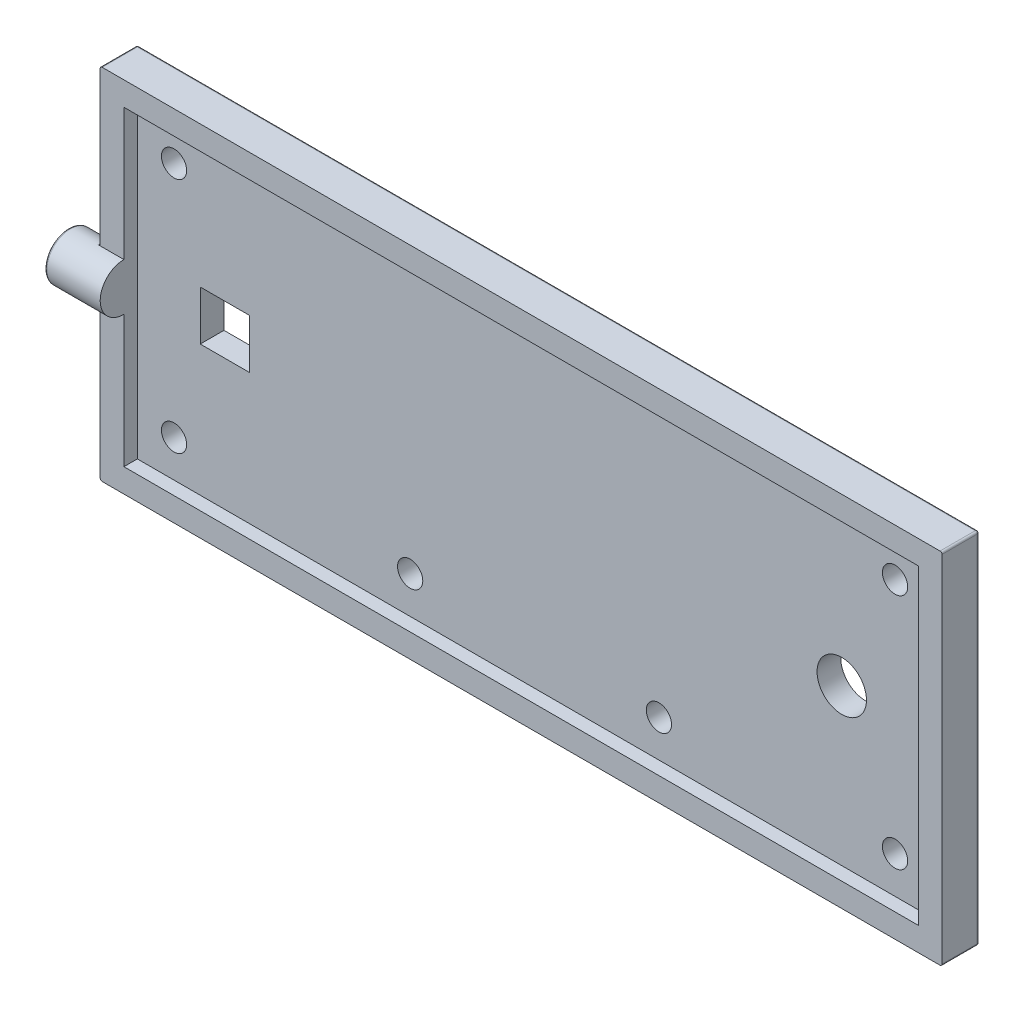
ISO-10303-21;
HEADER;
FILE_DESCRIPTION(('STEP AP214'),'2;1');
FILE_NAME('part.step','',(''),(''),'','','');
FILE_SCHEMA(('AUTOMOTIVE_DESIGN { 1 0 10303 214 1 1 1 1 }'));
ENDSEC;
DATA;
#1=APPLICATION_CONTEXT('core data for automotive mechanical design processes');
#2=APPLICATION_PROTOCOL_DEFINITION('international standard','automotive_design',2000,#1);
#3=PRODUCT_CONTEXT('',#1,'mechanical');
#4=PRODUCT('Part','Part','',(#3));
#5=PRODUCT_RELATED_PRODUCT_CATEGORY('part','',(#4));
#6=PRODUCT_DEFINITION_FORMATION('','',#4);
#7=PRODUCT_DEFINITION_CONTEXT('part definition',#1,'design');
#8=PRODUCT_DEFINITION('design','',#6,#7);
#9=PRODUCT_DEFINITION_SHAPE('','',#8);
#10=(LENGTH_UNIT() NAMED_UNIT(*) SI_UNIT(.MILLI.,.METRE.));
#11=(NAMED_UNIT(*) PLANE_ANGLE_UNIT() SI_UNIT($,.RADIAN.));
#12=(NAMED_UNIT(*) SI_UNIT($,.STERADIAN.) SOLID_ANGLE_UNIT());
#13=UNCERTAINTY_MEASURE_WITH_UNIT(LENGTH_MEASURE(1.E-05),#10,'distance_accuracy_value','');
#14=(GEOMETRIC_REPRESENTATION_CONTEXT(3) GLOBAL_UNCERTAINTY_ASSIGNED_CONTEXT((#13)) GLOBAL_UNIT_ASSIGNED_CONTEXT((#10,
#11,#12)) REPRESENTATION_CONTEXT('',''));
#15=CARTESIAN_POINT('',(0.,0.,0.));
#16=DIRECTION('',(0.,0.,1.));
#17=DIRECTION('',(1.,0.,0.));
#18=AXIS2_PLACEMENT_3D('',#15,#16,#17);
#19=CARTESIAN_POINT('',(0.,25.81,3.));
#20=DIRECTION('',(0.,1.,0.));
#21=DIRECTION('',(0.,0.,1.));
#22=AXIS2_PLACEMENT_3D('',#19,#20,#21);
#23=PLANE('',#22);
#24=DIRECTION('',(1.,0.,0.));
#25=VECTOR('',#24,1.);
#26=CARTESIAN_POINT('',(0.,25.81,0.));
#27=LINE('',#26,#25);
#28=CARTESIAN_POINT('',(10.955,25.81,0.));
#29=VERTEX_POINT('',#28);
#30=CARTESIAN_POINT('',(17.205,25.81,0.));
#31=VERTEX_POINT('',#30);
#32=EDGE_CURVE('E348',#29,#31,#27,.T.);
#33=ORIENTED_EDGE('',*,*,#32,.T.);
#34=DIRECTION('',(0.,0.,-1.));
#35=VECTOR('',#34,1.);
#36=CARTESIAN_POINT('',(17.205,25.81,3.));
#37=LINE('',#36,#35);
#38=CARTESIAN_POINT('',(17.205,25.81,3.));
#39=VERTEX_POINT('',#38);
#40=EDGE_CURVE('E371',#39,#31,#37,.T.);
#41=ORIENTED_EDGE('',*,*,#40,.F.);
#42=DIRECTION('',(1.,0.,0.));
#43=VECTOR('',#42,1.);
#44=CARTESIAN_POINT('',(0.,25.81,3.));
#45=LINE('',#44,#43);
#46=CARTESIAN_POINT('',(10.955,25.81,3.));
#47=VERTEX_POINT('',#46);
#48=EDGE_CURVE('E305',#47,#39,#45,.T.);
#49=ORIENTED_EDGE('',*,*,#48,.F.);
#50=DIRECTION('',(0.,0.,-1.));
#51=VECTOR('',#50,1.);
#52=CARTESIAN_POINT('',(10.955,25.81,3.));
#53=LINE('',#52,#51);
#54=EDGE_CURVE('E320',#47,#29,#53,.T.);
#55=ORIENTED_EDGE('',*,*,#54,.T.);
#56=EDGE_LOOP('',(#33,#41,#49,#55));
#57=FACE_BOUND('',#56,.T.);
#58=ADVANCED_FACE('F41',(#57),#23,.F.);
#59=CARTESIAN_POINT('',(17.205,0.,3.));
#60=DIRECTION('',(1.,0.,0.));
#61=DIRECTION('',(0.,0.,-1.));
#62=AXIS2_PLACEMENT_3D('',#59,#60,#61);
#63=PLANE('',#62);
#64=DIRECTION('',(0.,-1.,0.));
#65=VECTOR('',#64,1.);
#66=CARTESIAN_POINT('',(17.205,0.,0.));
#67=LINE('',#66,#65);
#68=CARTESIAN_POINT('',(17.205,19.56,0.));
#69=VERTEX_POINT('',#68);
#70=EDGE_CURVE('E352',#31,#69,#67,.T.);
#71=ORIENTED_EDGE('',*,*,#70,.T.);
#72=DIRECTION('',(0.,0.,-1.));
#73=VECTOR('',#72,1.);
#74=CARTESIAN_POINT('',(17.205,19.56,3.));
#75=LINE('',#74,#73);
#76=CARTESIAN_POINT('',(17.205,19.56,3.));
#77=VERTEX_POINT('',#76);
#78=EDGE_CURVE('E368',#77,#69,#75,.T.);
#79=ORIENTED_EDGE('',*,*,#78,.F.);
#80=DIRECTION('',(0.,-1.,0.));
#81=VECTOR('',#80,1.);
#82=CARTESIAN_POINT('',(17.205,0.,3.));
#83=LINE('',#82,#81);
#84=EDGE_CURVE('E309',#39,#77,#83,.T.);
#85=ORIENTED_EDGE('',*,*,#84,.F.);
#86=ORIENTED_EDGE('',*,*,#40,.T.);
#87=EDGE_LOOP('',(#71,#79,#85,#86));
#88=FACE_BOUND('',#87,.T.);
#89=ADVANCED_FACE('F586',(#88),#63,.F.);
#90=CARTESIAN_POINT('',(0.,19.56,3.));
#91=DIRECTION('',(0.,1.,0.));
#92=DIRECTION('',(0.,0.,1.));
#93=AXIS2_PLACEMENT_3D('',#90,#91,#92);
#94=PLANE('',#93);
#95=DIRECTION('',(1.,0.,0.));
#96=VECTOR('',#95,1.);
#97=CARTESIAN_POINT('',(0.,19.56,0.));
#98=LINE('',#97,#96);
#99=CARTESIAN_POINT('',(10.955,19.56,0.));
#100=VERTEX_POINT('',#99);
#101=EDGE_CURVE('E356',#100,#69,#98,.T.);
#102=ORIENTED_EDGE('',*,*,#101,.F.);
#103=DIRECTION('',(0.,0.,-1.));
#104=VECTOR('',#103,1.);
#105=CARTESIAN_POINT('',(10.955,19.56,3.));
#106=LINE('',#105,#104);
#107=CARTESIAN_POINT('',(10.955,19.56,3.));
#108=VERTEX_POINT('',#107);
#109=EDGE_CURVE('E365',#108,#100,#106,.T.);
#110=ORIENTED_EDGE('',*,*,#109,.F.);
#111=DIRECTION('',(1.,0.,0.));
#112=VECTOR('',#111,1.);
#113=CARTESIAN_POINT('',(0.,19.56,3.));
#114=LINE('',#113,#112);
#115=EDGE_CURVE('E312',#108,#77,#114,.T.);
#116=ORIENTED_EDGE('',*,*,#115,.T.);
#117=ORIENTED_EDGE('',*,*,#78,.T.);
#118=EDGE_LOOP('',(#102,#110,#116,#117));
#119=FACE_BOUND('',#118,.T.);
#120=ADVANCED_FACE('F592',(#119),#94,.T.);
#121=CARTESIAN_POINT('',(7.63999999999999,7.68,3.));
#122=DIRECTION('',(0.,0.,-1.));
#123=DIRECTION('',(-1.,0.,0.));
#124=AXIS2_PLACEMENT_3D('',#121,#122,#123);
#125=CYLINDRICAL_SURFACE('',#124,1.595);
#126=CARTESIAN_POINT('',(7.63999999999999,7.68,3.));
#127=DIRECTION('',(0.,0.,1.));
#128=DIRECTION('',(1.,0.,0.));
#129=AXIS2_PLACEMENT_3D('',#126,#127,#128);
#130=CIRCLE('',#129,1.595);
#131=CARTESIAN_POINT('',(9.23499999999999,7.68,3.));
#132=VERTEX_POINT('',#131);
#133=EDGE_CURVE('E288',#132,#132,#130,.T.);
#134=ORIENTED_EDGE('',*,*,#133,.T.);
#135=EDGE_LOOP('',(#134));
#136=FACE_BOUND('',#135,.T.);
#137=CARTESIAN_POINT('',(7.63999999999999,7.68,0.));
#138=DIRECTION('',(0.,0.,1.));
#139=DIRECTION('',(1.,0.,0.));
#140=AXIS2_PLACEMENT_3D('',#137,#138,#139);
#141=CIRCLE('',#140,1.595);
#142=CARTESIAN_POINT('',(9.23499999999999,7.68,0.));
#143=VERTEX_POINT('',#142);
#144=EDGE_CURVE('E344',#143,#143,#141,.T.);
#145=ORIENTED_EDGE('',*,*,#144,.F.);
#146=EDGE_LOOP('',(#145));
#147=FACE_BOUND('',#146,.T.);
#148=ADVANCED_FACE('F597',(#136,#147),#125,.F.);
#149=CARTESIAN_POINT('',(37.5,7.68,3.));
#150=DIRECTION('',(0.,0.,-1.));
#151=DIRECTION('',(-1.,0.,0.));
#152=AXIS2_PLACEMENT_3D('',#149,#150,#151);
#153=CYLINDRICAL_SURFACE('',#152,1.595);
#154=CARTESIAN_POINT('',(37.5,7.68,3.));
#155=DIRECTION('',(0.,0.,1.));
#156=DIRECTION('',(1.,0.,0.));
#157=AXIS2_PLACEMENT_3D('',#154,#155,#156);
#158=CIRCLE('',#157,1.595);
#159=CARTESIAN_POINT('',(39.095,7.68,3.));
#160=VERTEX_POINT('',#159);
#161=EDGE_CURVE('E284',#160,#160,#158,.T.);
#162=ORIENTED_EDGE('',*,*,#161,.T.);
#163=EDGE_LOOP('',(#162));
#164=FACE_BOUND('',#163,.T.);
#165=CARTESIAN_POINT('',(37.5,7.68,0.));
#166=DIRECTION('',(0.,0.,1.));
#167=DIRECTION('',(1.,0.,0.));
#168=AXIS2_PLACEMENT_3D('',#165,#166,#167);
#169=CIRCLE('',#168,1.595);
#170=CARTESIAN_POINT('',(39.095,7.68,0.));
#171=VERTEX_POINT('',#170);
#172=EDGE_CURVE('E340',#171,#171,#169,.T.);
#173=ORIENTED_EDGE('',*,*,#172,.F.);
#174=EDGE_LOOP('',(#173));
#175=FACE_BOUND('',#174,.T.);
#176=ADVANCED_FACE('F600',(#164,#175),#153,.F.);
#177=CARTESIAN_POINT('',(68.96,7.68,3.));
#178=DIRECTION('',(0.,0.,-1.));
#179=DIRECTION('',(-1.,0.,0.));
#180=AXIS2_PLACEMENT_3D('',#177,#178,#179);
#181=CYLINDRICAL_SURFACE('',#180,1.595);
#182=CARTESIAN_POINT('',(68.96,7.68,3.));
#183=DIRECTION('',(0.,0.,1.));
#184=DIRECTION('',(1.,0.,0.));
#185=AXIS2_PLACEMENT_3D('',#182,#183,#184);
#186=CIRCLE('',#185,1.595);
#187=CARTESIAN_POINT('',(70.555,7.68,3.));
#188=VERTEX_POINT('',#187);
#189=EDGE_CURVE('E280',#188,#188,#186,.T.);
#190=ORIENTED_EDGE('',*,*,#189,.T.);
#191=EDGE_LOOP('',(#190));
#192=FACE_BOUND('',#191,.T.);
#193=CARTESIAN_POINT('',(68.96,7.68,0.));
#194=DIRECTION('',(0.,0.,1.));
#195=DIRECTION('',(1.,0.,0.));
#196=AXIS2_PLACEMENT_3D('',#193,#194,#195);
#197=CIRCLE('',#196,1.595);
#198=CARTESIAN_POINT('',(70.555,7.68,0.));
#199=VERTEX_POINT('',#198);
#200=EDGE_CURVE('E336',#199,#199,#197,.T.);
#201=ORIENTED_EDGE('',*,*,#200,.F.);
#202=EDGE_LOOP('',(#201));
#203=FACE_BOUND('',#202,.T.);
#204=ADVANCED_FACE('F604',(#192,#203),#181,.F.);
#205=CARTESIAN_POINT('',(98.82,7.68,3.));
#206=DIRECTION('',(0.,0.,-1.));
#207=DIRECTION('',(-1.,0.,0.));
#208=AXIS2_PLACEMENT_3D('',#205,#206,#207);
#209=CYLINDRICAL_SURFACE('',#208,1.595);
#210=CARTESIAN_POINT('',(98.82,7.68,3.));
#211=DIRECTION('',(0.,0.,1.));
#212=DIRECTION('',(1.,0.,0.));
#213=AXIS2_PLACEMENT_3D('',#210,#211,#212);
#214=CIRCLE('',#213,1.595);
#215=CARTESIAN_POINT('',(100.415,7.68,3.));
#216=VERTEX_POINT('',#215);
#217=EDGE_CURVE('E276',#216,#216,#214,.T.);
#218=ORIENTED_EDGE('',*,*,#217,.T.);
#219=EDGE_LOOP('',(#218));
#220=FACE_BOUND('',#219,.T.);
#221=CARTESIAN_POINT('',(98.82,7.68,0.));
#222=DIRECTION('',(0.,0.,1.));
#223=DIRECTION('',(1.,0.,0.));
#224=AXIS2_PLACEMENT_3D('',#221,#222,#223);
#225=CIRCLE('',#224,1.595);
#226=CARTESIAN_POINT('',(100.415,7.68,0.));
#227=VERTEX_POINT('',#226);
#228=EDGE_CURVE('E332',#227,#227,#225,.T.);
#229=ORIENTED_EDGE('',*,*,#228,.F.);
#230=EDGE_LOOP('',(#229));
#231=FACE_BOUND('',#230,.T.);
#232=ADVANCED_FACE('F608',(#220,#231),#209,.F.);
#233=CARTESIAN_POINT('',(7.63999999999999,37.69,3.));
#234=DIRECTION('',(0.,0.,-1.));
#235=DIRECTION('',(-1.,0.,0.));
#236=AXIS2_PLACEMENT_3D('',#233,#234,#235);
#237=CYLINDRICAL_SURFACE('',#236,1.595);
#238=CARTESIAN_POINT('',(7.63999999999999,37.69,3.));
#239=DIRECTION('',(0.,0.,1.));
#240=DIRECTION('',(1.,0.,0.));
#241=AXIS2_PLACEMENT_3D('',#238,#239,#240);
#242=CIRCLE('',#241,1.595);
#243=CARTESIAN_POINT('',(9.23499999999999,37.69,3.));
#244=VERTEX_POINT('',#243);
#245=EDGE_CURVE('E272',#244,#244,#242,.T.);
#246=ORIENTED_EDGE('',*,*,#245,.T.);
#247=EDGE_LOOP('',(#246));
#248=FACE_BOUND('',#247,.T.);
#249=CARTESIAN_POINT('',(7.63999999999999,37.69,0.));
#250=DIRECTION('',(0.,0.,1.));
#251=DIRECTION('',(1.,0.,0.));
#252=AXIS2_PLACEMENT_3D('',#249,#250,#251);
#253=CIRCLE('',#252,1.595);
#254=CARTESIAN_POINT('',(9.23499999999999,37.69,0.));
#255=VERTEX_POINT('',#254);
#256=EDGE_CURVE('E328',#255,#255,#253,.T.);
#257=ORIENTED_EDGE('',*,*,#256,.F.);
#258=EDGE_LOOP('',(#257));
#259=FACE_BOUND('',#258,.T.);
#260=ADVANCED_FACE('F612',(#248,#259),#237,.F.);
#261=CARTESIAN_POINT('',(98.82,37.69,3.));
#262=DIRECTION('',(0.,0.,-1.));
#263=DIRECTION('',(-1.,0.,0.));
#264=AXIS2_PLACEMENT_3D('',#261,#262,#263);
#265=CYLINDRICAL_SURFACE('',#264,1.595);
#266=CARTESIAN_POINT('',(98.82,37.69,3.));
#267=DIRECTION('',(0.,0.,1.));
#268=DIRECTION('',(1.,0.,0.));
#269=AXIS2_PLACEMENT_3D('',#266,#267,#268);
#270=CIRCLE('',#269,1.595);
#271=CARTESIAN_POINT('',(100.415,37.69,3.));
#272=VERTEX_POINT('',#271);
#273=EDGE_CURVE('E267',#272,#272,#270,.T.);
#274=ORIENTED_EDGE('',*,*,#273,.T.);
#275=EDGE_LOOP('',(#274));
#276=FACE_BOUND('',#275,.T.);
#277=CARTESIAN_POINT('',(98.82,37.69,0.));
#278=DIRECTION('',(0.,0.,1.));
#279=DIRECTION('',(1.,0.,0.));
#280=AXIS2_PLACEMENT_3D('',#277,#278,#279);
#281=CIRCLE('',#280,1.595);
#282=CARTESIAN_POINT('',(100.415,37.69,0.));
#283=VERTEX_POINT('',#282);
#284=EDGE_CURVE('E324',#283,#283,#281,.T.);
#285=ORIENTED_EDGE('',*,*,#284,.F.);
#286=EDGE_LOOP('',(#285));
#287=FACE_BOUND('',#286,.T.);
#288=ADVANCED_FACE('F616',(#276,#287),#265,.F.);
#289=CARTESIAN_POINT('',(92.08,22.685,3.));
#290=DIRECTION('',(0.,0.,-1.));
#291=DIRECTION('',(-1.,0.,0.));
#292=AXIS2_PLACEMENT_3D('',#289,#290,#291);
#293=CYLINDRICAL_SURFACE('',#292,3.125);
#294=CARTESIAN_POINT('',(92.08,22.685,3.));
#295=DIRECTION('',(0.,0.,1.));
#296=DIRECTION('',(1.,0.,0.));
#297=AXIS2_PLACEMENT_3D('',#294,#295,#296);
#298=CIRCLE('',#297,3.125);
#299=CARTESIAN_POINT('',(95.205,22.685,3.));
#300=VERTEX_POINT('',#299);
#301=EDGE_CURVE('E263',#300,#300,#298,.T.);
#302=ORIENTED_EDGE('',*,*,#301,.T.);
#303=EDGE_LOOP('',(#302));
#304=FACE_BOUND('',#303,.T.);
#305=CARTESIAN_POINT('',(92.08,22.685,0.));
#306=DIRECTION('',(0.,0.,1.));
#307=DIRECTION('',(1.,0.,0.));
#308=AXIS2_PLACEMENT_3D('',#305,#306,#307);
#309=CIRCLE('',#308,3.125);
#310=CARTESIAN_POINT('',(95.205,22.685,0.));
#311=VERTEX_POINT('',#310);
#312=EDGE_CURVE('E262',#311,#311,#309,.T.);
#313=ORIENTED_EDGE('',*,*,#312,.F.);
#314=EDGE_LOOP('',(#313));
#315=FACE_BOUND('',#314,.T.);
#316=ADVANCED_FACE('F620',(#304,#315),#293,.F.);
#317=CARTESIAN_POINT('',(10.955,0.,3.));
#318=DIRECTION('',(1.,0.,0.));
#319=DIRECTION('',(0.,1.,0.));
#320=AXIS2_PLACEMENT_3D('',#317,#318,#319);
#321=PLANE('',#320);
#322=DIRECTION('',(0.,-1.,0.));
#323=VECTOR('',#322,1.);
#324=CARTESIAN_POINT('',(10.955,0.,0.));
#325=LINE('',#324,#323);
#326=EDGE_CURVE('E268',#29,#100,#325,.T.);
#327=ORIENTED_EDGE('',*,*,#326,.F.);
#328=ORIENTED_EDGE('',*,*,#54,.F.);
#329=DIRECTION('',(0.,-1.,0.));
#330=VECTOR('',#329,1.);
#331=CARTESIAN_POINT('',(10.955,0.,3.));
#332=LINE('',#331,#330);
#333=EDGE_CURVE('E316',#47,#108,#332,.T.);
#334=ORIENTED_EDGE('',*,*,#333,.T.);
#335=ORIENTED_EDGE('',*,*,#109,.T.);
#336=EDGE_LOOP('',(#327,#328,#334,#335));
#337=FACE_BOUND('',#336,.T.);
#338=ADVANCED_FACE('F624',(#337),#321,.T.);
#339=CARTESIAN_POINT('',(0.,0.,3.));
#340=DIRECTION('',(0.,0.,1.));
#341=DIRECTION('',(1.,0.,0.));
#342=AXIS2_PLACEMENT_3D('',#339,#340,#341);
#343=PLANE('',#342);
#344=ORIENTED_EDGE('',*,*,#301,.F.);
#345=EDGE_LOOP('',(#344));
#346=FACE_BOUND('',#345,.T.);
#347=ORIENTED_EDGE('',*,*,#273,.F.);
#348=EDGE_LOOP('',(#347));
#349=FACE_BOUND('',#348,.T.);
#350=ORIENTED_EDGE('',*,*,#245,.F.);
#351=EDGE_LOOP('',(#350));
#352=FACE_BOUND('',#351,.T.);
#353=ORIENTED_EDGE('',*,*,#217,.F.);
#354=EDGE_LOOP('',(#353));
#355=FACE_BOUND('',#354,.T.);
#356=ORIENTED_EDGE('',*,*,#189,.F.);
#357=EDGE_LOOP('',(#356));
#358=FACE_BOUND('',#357,.T.);
#359=ORIENTED_EDGE('',*,*,#161,.F.);
#360=EDGE_LOOP('',(#359));
#361=FACE_BOUND('',#360,.T.);
#362=ORIENTED_EDGE('',*,*,#133,.F.);
#363=EDGE_LOOP('',(#362));
#364=FACE_BOUND('',#363,.T.);
#365=DIRECTION('',(1.,0.,0.));
#366=VECTOR('',#365,1.);
#367=CARTESIAN_POINT('',(0.,3.,3.));
#368=LINE('',#367,#366);
#369=CARTESIAN_POINT('',(3.,3.,3.));
#370=VERTEX_POINT('',#369);
#371=CARTESIAN_POINT('',(103.46,3.,3.));
#372=VERTEX_POINT('',#371);
#373=EDGE_CURVE('E292',#370,#372,#368,.T.);
#374=ORIENTED_EDGE('',*,*,#373,.T.);
#375=DIRECTION('',(0.,1.,0.));
#376=VECTOR('',#375,1.);
#377=CARTESIAN_POINT('',(103.46,0.,3.));
#378=LINE('',#377,#376);
#379=CARTESIAN_POINT('',(103.46,42.37,3.));
#380=VERTEX_POINT('',#379);
#381=EDGE_CURVE('E295',#372,#380,#378,.T.);
#382=ORIENTED_EDGE('',*,*,#381,.T.);
#383=DIRECTION('',(1.,0.,0.));
#384=VECTOR('',#383,1.);
#385=CARTESIAN_POINT('',(0.,42.37,3.));
#386=LINE('',#385,#384);
#387=CARTESIAN_POINT('',(3.,42.37,3.));
#388=VERTEX_POINT('',#387);
#389=EDGE_CURVE('E298',#388,#380,#386,.T.);
#390=ORIENTED_EDGE('',*,*,#389,.F.);
#391=DIRECTION('',(0.,1.,0.));
#392=VECTOR('',#391,1.);
#393=CARTESIAN_POINT('',(3.,0.,3.));
#394=LINE('',#393,#392);
#395=EDGE_CURVE('E302',#370,#388,#394,.T.);
#396=ORIENTED_EDGE('',*,*,#395,.F.);
#397=EDGE_LOOP('',(#374,#382,#390,#396));
#398=FACE_BOUND('',#397,.T.);
#399=ORIENTED_EDGE('',*,*,#48,.T.);
#400=ORIENTED_EDGE('',*,*,#84,.T.);
#401=ORIENTED_EDGE('',*,*,#115,.F.);
#402=ORIENTED_EDGE('',*,*,#333,.F.);
#403=EDGE_LOOP('',(#399,#400,#401,#402));
#404=FACE_BOUND('',#403,.T.);
#405=ADVANCED_FACE('F569',(#346,#349,#352,#355,#358,#361,#364,#398,#404),#343,.T.);
#406=CARTESIAN_POINT('',(0.,0.,0.));
#407=DIRECTION('',(0.,0.,1.));
#408=DIRECTION('',(1.,0.,0.));
#409=AXIS2_PLACEMENT_3D('',#406,#407,#408);
#410=PLANE('',#409);
#411=DIRECTION('',(0.,1.,0.));
#412=VECTOR('',#411,1.);
#413=CARTESIAN_POINT('',(0.25,45.37,0.));
#414=LINE('',#413,#412);
#415=CARTESIAN_POINT('',(0.25,0.25,0.));
#416=VERTEX_POINT('',#415);
#417=CARTESIAN_POINT('',(0.25,45.12,0.));
#418=VERTEX_POINT('',#417);
#419=EDGE_CURVE('E421',#416,#418,#414,.T.);
#420=ORIENTED_EDGE('',*,*,#419,.T.);
#421=DIRECTION('',(1.,0.,0.));
#422=VECTOR('',#421,1.);
#423=CARTESIAN_POINT('',(106.46,45.12,0.));
#424=LINE('',#423,#422);
#425=CARTESIAN_POINT('',(106.21,45.12,0.));
#426=VERTEX_POINT('',#425);
#427=EDGE_CURVE('E430',#418,#426,#424,.T.);
#428=ORIENTED_EDGE('',*,*,#427,.T.);
#429=DIRECTION('',(0.,1.,0.));
#430=VECTOR('',#429,1.);
#431=CARTESIAN_POINT('',(106.21,0.,0.));
#432=LINE('',#431,#430);
#433=CARTESIAN_POINT('',(106.21,0.25,0.));
#434=VERTEX_POINT('',#433);
#435=EDGE_CURVE('E427',#426,#434,#432,.F.);
#436=ORIENTED_EDGE('',*,*,#435,.T.);
#437=DIRECTION('',(1.,0.,0.));
#438=VECTOR('',#437,1.);
#439=CARTESIAN_POINT('',(0.,0.25,0.));
#440=LINE('',#439,#438);
#441=EDGE_CURVE('E424',#434,#416,#440,.F.);
#442=ORIENTED_EDGE('',*,*,#441,.T.);
#443=EDGE_LOOP('',(#420,#428,#436,#442));
#444=FACE_BOUND('',#443,.T.);
#445=ORIENTED_EDGE('',*,*,#312,.T.);
#446=EDGE_LOOP('',(#445));
#447=FACE_BOUND('',#446,.T.);
#448=ORIENTED_EDGE('',*,*,#284,.T.);
#449=EDGE_LOOP('',(#448));
#450=FACE_BOUND('',#449,.T.);
#451=ORIENTED_EDGE('',*,*,#256,.T.);
#452=EDGE_LOOP('',(#451));
#453=FACE_BOUND('',#452,.T.);
#454=ORIENTED_EDGE('',*,*,#228,.T.);
#455=EDGE_LOOP('',(#454));
#456=FACE_BOUND('',#455,.T.);
#457=ORIENTED_EDGE('',*,*,#200,.T.);
#458=EDGE_LOOP('',(#457));
#459=FACE_BOUND('',#458,.T.);
#460=ORIENTED_EDGE('',*,*,#172,.T.);
#461=EDGE_LOOP('',(#460));
#462=FACE_BOUND('',#461,.T.);
#463=ORIENTED_EDGE('',*,*,#144,.T.);
#464=EDGE_LOOP('',(#463));
#465=FACE_BOUND('',#464,.T.);
#466=ORIENTED_EDGE('',*,*,#32,.F.);
#467=ORIENTED_EDGE('',*,*,#326,.T.);
#468=ORIENTED_EDGE('',*,*,#101,.T.);
#469=ORIENTED_EDGE('',*,*,#70,.F.);
#470=EDGE_LOOP('',(#466,#467,#468,#469));
#471=FACE_BOUND('',#470,.T.);
#472=ADVANCED_FACE('F523',(#444,#447,#450,#453,#456,#459,#462,#465,#471),#410,.F.);
#473=CARTESIAN_POINT('',(0.,0.,4.7));
#474=DIRECTION('',(0.,1.,0.));
#475=DIRECTION('',(0.,0.,1.));
#476=AXIS2_PLACEMENT_3D('',#473,#474,#475);
#477=PLANE('',#476);
#478=DIRECTION('',(1.,0.,0.));
#479=VECTOR('',#478,1.);
#480=CARTESIAN_POINT('',(0.,0.,0.25));
#481=LINE('',#480,#479);
#482=CARTESIAN_POINT('',(0.25,0.,0.25));
#483=VERTEX_POINT('',#482);
#484=CARTESIAN_POINT('',(106.21,0.,0.25));
#485=VERTEX_POINT('',#484);
#486=EDGE_CURVE('E59',#483,#485,#481,.T.);
#487=ORIENTED_EDGE('',*,*,#486,.T.);
#488=DIRECTION('',(0.,0.,-1.));
#489=VECTOR('',#488,1.);
#490=CARTESIAN_POINT('',(106.21,0.,4.7));
#491=LINE('',#490,#489);
#492=CARTESIAN_POINT('',(106.21,0.,4.7));
#493=VERTEX_POINT('',#492);
#494=EDGE_CURVE('E447',#485,#493,#491,.F.);
#495=ORIENTED_EDGE('',*,*,#494,.T.);
#496=DIRECTION('',(1.,0.,0.));
#497=VECTOR('',#496,1.);
#498=CARTESIAN_POINT('',(0.,0.,4.7));
#499=LINE('',#498,#497);
#500=CARTESIAN_POINT('',(0.25,0.,4.7));
#501=VERTEX_POINT('',#500);
#502=EDGE_CURVE('E231',#501,#493,#499,.T.);
#503=ORIENTED_EDGE('',*,*,#502,.F.);
#504=DIRECTION('',(0.,0.,-1.));
#505=VECTOR('',#504,1.);
#506=CARTESIAN_POINT('',(0.25,0.,0.));
#507=LINE('',#506,#505);
#508=EDGE_CURVE('E64',#501,#483,#507,.T.);
#509=ORIENTED_EDGE('',*,*,#508,.T.);
#510=EDGE_LOOP('',(#487,#495,#503,#509));
#511=FACE_BOUND('',#510,.T.);
#512=ADVANCED_FACE('F506',(#511),#477,.F.);
#513=CARTESIAN_POINT('',(106.46,0.,4.7));
#514=DIRECTION('',(-1.,0.,0.));
#515=DIRECTION('',(0.,0.,1.));
#516=AXIS2_PLACEMENT_3D('',#513,#514,#515);
#517=PLANE('',#516);
#518=DIRECTION('',(0.,1.,0.));
#519=VECTOR('',#518,1.);
#520=CARTESIAN_POINT('',(106.46,0.,0.25));
#521=LINE('',#520,#519);
#522=CARTESIAN_POINT('',(106.46,0.25,0.25));
#523=VERTEX_POINT('',#522);
#524=CARTESIAN_POINT('',(106.46,45.12,0.25));
#525=VERTEX_POINT('',#524);
#526=EDGE_CURVE('E434',#523,#525,#521,.T.);
#527=ORIENTED_EDGE('',*,*,#526,.T.);
#528=DIRECTION('',(0.,0.,-1.));
#529=VECTOR('',#528,1.);
#530=CARTESIAN_POINT('',(106.46,45.12,4.7));
#531=LINE('',#530,#529);
#532=CARTESIAN_POINT('',(106.46,45.12,4.7));
#533=VERTEX_POINT('',#532);
#534=EDGE_CURVE('E440',#525,#533,#531,.F.);
#535=ORIENTED_EDGE('',*,*,#534,.T.);
#536=DIRECTION('',(0.,1.,0.));
#537=VECTOR('',#536,1.);
#538=CARTESIAN_POINT('',(106.46,0.,4.7));
#539=LINE('',#538,#537);
#540=CARTESIAN_POINT('',(106.46,0.25,4.7));
#541=VERTEX_POINT('',#540);
#542=EDGE_CURVE('E235',#541,#533,#539,.T.);
#543=ORIENTED_EDGE('',*,*,#542,.F.);
#544=DIRECTION('',(0.,0.,-1.));
#545=VECTOR('',#544,1.);
#546=CARTESIAN_POINT('',(106.46,0.25,4.7));
#547=LINE('',#546,#545);
#548=EDGE_CURVE('E437',#541,#523,#547,.T.);
#549=ORIENTED_EDGE('',*,*,#548,.T.);
#550=EDGE_LOOP('',(#527,#535,#543,#549));
#551=FACE_BOUND('',#550,.T.);
#552=ADVANCED_FACE('F540',(#551),#517,.F.);
#553=CARTESIAN_POINT('',(0.,45.37,4.7));
#554=DIRECTION('',(0.,1.,0.));
#555=DIRECTION('',(0.,0.,1.));
#556=AXIS2_PLACEMENT_3D('',#553,#554,#555);
#557=PLANE('',#556);
#558=DIRECTION('',(1.,0.,0.));
#559=VECTOR('',#558,1.);
#560=CARTESIAN_POINT('',(0.,45.37,0.25));
#561=LINE('',#560,#559);
#562=CARTESIAN_POINT('',(106.21,45.37,0.25));
#563=VERTEX_POINT('',#562);
#564=CARTESIAN_POINT('',(0.25,45.37,0.25));
#565=VERTEX_POINT('',#564);
#566=EDGE_CURVE('E403',#563,#565,#561,.F.);
#567=ORIENTED_EDGE('',*,*,#566,.T.);
#568=DIRECTION('',(0.,0.,-1.));
#569=VECTOR('',#568,1.);
#570=CARTESIAN_POINT('',(0.25,45.37,4.7));
#571=LINE('',#570,#569);
#572=CARTESIAN_POINT('',(0.25,45.37,4.7));
#573=VERTEX_POINT('',#572);
#574=EDGE_CURVE('E406',#565,#573,#571,.F.);
#575=ORIENTED_EDGE('',*,*,#574,.T.);
#576=DIRECTION('',(1.,0.,0.));
#577=VECTOR('',#576,1.);
#578=CARTESIAN_POINT('',(0.,45.37,4.7));
#579=LINE('',#578,#577);
#580=CARTESIAN_POINT('',(106.21,45.37,4.7));
#581=VERTEX_POINT('',#580);
#582=EDGE_CURVE('E239',#573,#581,#579,.T.);
#583=ORIENTED_EDGE('',*,*,#582,.T.);
#584=DIRECTION('',(0.,0.,-1.));
#585=VECTOR('',#584,1.);
#586=CARTESIAN_POINT('',(106.21,45.37,0.));
#587=LINE('',#586,#585);
#588=EDGE_CURVE('E400',#581,#563,#587,.T.);
#589=ORIENTED_EDGE('',*,*,#588,.T.);
#590=EDGE_LOOP('',(#567,#575,#583,#589));
#591=FACE_BOUND('',#590,.T.);
#592=ADVANCED_FACE('F547',(#591),#557,.T.);
#593=CARTESIAN_POINT('',(103.46,0.,4.7));
#594=DIRECTION('',(-1.,0.,0.));
#595=DIRECTION('',(0.,0.,1.));
#596=AXIS2_PLACEMENT_3D('',#593,#594,#595);
#597=PLANE('',#596);
#598=DIRECTION('',(0.,0.,-1.));
#599=VECTOR('',#598,1.);
#600=CARTESIAN_POINT('',(103.46,42.37,4.7));
#601=LINE('',#600,#599);
#602=CARTESIAN_POINT('',(103.46,42.37,4.7));
#603=VERTEX_POINT('',#602);
#604=EDGE_CURVE('E248',#603,#380,#601,.T.);
#605=ORIENTED_EDGE('',*,*,#604,.T.);
#606=ORIENTED_EDGE('',*,*,#381,.F.);
#607=DIRECTION('',(0.,0.,-1.));
#608=VECTOR('',#607,1.);
#609=CARTESIAN_POINT('',(103.46,3.,4.7));
#610=LINE('',#609,#608);
#611=CARTESIAN_POINT('',(103.46,3.,4.7));
#612=VERTEX_POINT('',#611);
#613=EDGE_CURVE('E258',#612,#372,#610,.T.);
#614=ORIENTED_EDGE('',*,*,#613,.F.);
#615=DIRECTION('',(0.,1.,0.));
#616=VECTOR('',#615,1.);
#617=CARTESIAN_POINT('',(103.46,0.,4.7));
#618=LINE('',#617,#616);
#619=EDGE_CURVE('E215',#612,#603,#618,.T.);
#620=ORIENTED_EDGE('',*,*,#619,.T.);
#621=EDGE_LOOP('',(#605,#606,#614,#620));
#622=FACE_BOUND('',#621,.T.);
#623=ADVANCED_FACE('F572',(#622),#597,.T.);
#624=CARTESIAN_POINT('',(0.,3.,4.7));
#625=DIRECTION('',(0.,1.,0.));
#626=DIRECTION('',(0.,0.,1.));
#627=AXIS2_PLACEMENT_3D('',#624,#625,#626);
#628=PLANE('',#627);
#629=ORIENTED_EDGE('',*,*,#613,.T.);
#630=ORIENTED_EDGE('',*,*,#373,.F.);
#631=DIRECTION('',(0.,0.,-1.));
#632=VECTOR('',#631,1.);
#633=CARTESIAN_POINT('',(3.,3.,4.7));
#634=LINE('',#633,#632);
#635=CARTESIAN_POINT('',(3.,3.,4.7));
#636=VERTEX_POINT('',#635);
#637=EDGE_CURVE('E254',#636,#370,#634,.T.);
#638=ORIENTED_EDGE('',*,*,#637,.F.);
#639=DIRECTION('',(1.,0.,0.));
#640=VECTOR('',#639,1.);
#641=CARTESIAN_POINT('',(0.,3.,4.7));
#642=LINE('',#641,#640);
#643=EDGE_CURVE('E198',#636,#612,#642,.T.);
#644=ORIENTED_EDGE('',*,*,#643,.T.);
#645=EDGE_LOOP('',(#629,#630,#638,#644));
#646=FACE_BOUND('',#645,.T.);
#647=ADVANCED_FACE('F566',(#646),#628,.T.);
#648=CARTESIAN_POINT('',(3.,0.,4.7));
#649=DIRECTION('',(-1.,0.,0.));
#650=DIRECTION('',(0.,0.,1.));
#651=AXIS2_PLACEMENT_3D('',#648,#649,#650);
#652=PLANE('',#651);
#653=ORIENTED_EDGE('',*,*,#395,.T.);
#654=DIRECTION('',(0.,0.,-1.));
#655=VECTOR('',#654,1.);
#656=CARTESIAN_POINT('',(3.,42.37,4.7));
#657=LINE('',#656,#655);
#658=CARTESIAN_POINT('',(3.,42.37,4.7));
#659=VERTEX_POINT('',#658);
#660=EDGE_CURVE('E193',#659,#388,#657,.T.);
#661=ORIENTED_EDGE('',*,*,#660,.F.);
#662=DIRECTION('',(0.,1.,0.));
#663=VECTOR('',#662,1.);
#664=CARTESIAN_POINT('',(3.,0.,4.7));
#665=LINE('',#664,#663);
#666=CARTESIAN_POINT('',(3.,25.685,4.7));
#667=VERTEX_POINT('',#666);
#668=EDGE_CURVE('E186',#667,#659,#665,.T.);
#669=ORIENTED_EDGE('',*,*,#668,.F.);
#670=CARTESIAN_POINT('',(3.,22.685,4.7));
#671=DIRECTION('',(-1.,0.,0.));
#672=DIRECTION('',(0.,0.,1.));
#673=AXIS2_PLACEMENT_3D('',#670,#671,#672);
#674=CIRCLE('',#673,3.);
#675=CARTESIAN_POINT('',(3.,19.685,4.7));
#676=VERTEX_POINT('',#675);
#677=EDGE_CURVE('E191',#676,#667,#674,.T.);
#678=ORIENTED_EDGE('',*,*,#677,.F.);
#679=EDGE_CURVE('E197',#636,#676,#665,.T.);
#680=ORIENTED_EDGE('',*,*,#679,.F.);
#681=ORIENTED_EDGE('',*,*,#637,.T.);
#682=EDGE_LOOP('',(#653,#661,#669,#678,#680,#681));
#683=FACE_BOUND('',#682,.T.);
#684=ADVANCED_FACE('F188',(#683),#652,.F.);
#685=CARTESIAN_POINT('',(0.,42.37,4.7));
#686=DIRECTION('',(0.,1.,0.));
#687=DIRECTION('',(0.,0.,1.));
#688=AXIS2_PLACEMENT_3D('',#685,#686,#687);
#689=PLANE('',#688);
#690=ORIENTED_EDGE('',*,*,#389,.T.);
#691=ORIENTED_EDGE('',*,*,#604,.F.);
#692=DIRECTION('',(1.,0.,0.));
#693=VECTOR('',#692,1.);
#694=CARTESIAN_POINT('',(0.,42.37,4.7));
#695=LINE('',#694,#693);
#696=EDGE_CURVE('E228',#659,#603,#695,.T.);
#697=ORIENTED_EDGE('',*,*,#696,.F.);
#698=ORIENTED_EDGE('',*,*,#660,.T.);
#699=EDGE_LOOP('',(#690,#691,#697,#698));
#700=FACE_BOUND('',#699,.T.);
#701=ADVANCED_FACE('F575',(#700),#689,.F.);
#702=CARTESIAN_POINT('',(0.,0.,4.7));
#703=DIRECTION('',(-1.,0.,0.));
#704=DIRECTION('',(0.,0.,1.));
#705=AXIS2_PLACEMENT_3D('',#702,#703,#704);
#706=PLANE('',#705);
#707=DIRECTION('',(0.,1.,0.));
#708=VECTOR('',#707,1.);
#709=CARTESIAN_POINT('',(0.,0.,4.7));
#710=LINE('',#709,#708);
#711=CARTESIAN_POINT('',(0.,25.935,4.7));
#712=VERTEX_POINT('',#711);
#713=CARTESIAN_POINT('',(0.,45.12,4.7));
#714=VERTEX_POINT('',#713);
#715=EDGE_CURVE('E243',#712,#714,#710,.T.);
#716=ORIENTED_EDGE('',*,*,#715,.T.);
#717=DIRECTION('',(0.,0.,-1.));
#718=VECTOR('',#717,1.);
#719=CARTESIAN_POINT('',(0.,45.12,4.7));
#720=LINE('',#719,#718);
#721=CARTESIAN_POINT('',(0.,45.12,0.25));
#722=VERTEX_POINT('',#721);
#723=EDGE_CURVE('E396',#714,#722,#720,.T.);
#724=ORIENTED_EDGE('',*,*,#723,.T.);
#725=DIRECTION('',(0.,1.,0.));
#726=VECTOR('',#725,1.);
#727=CARTESIAN_POINT('',(0.,0.,0.25));
#728=LINE('',#727,#726);
#729=CARTESIAN_POINT('',(0.,0.25,0.25));
#730=VERTEX_POINT('',#729);
#731=EDGE_CURVE('E390',#722,#730,#728,.F.);
#732=ORIENTED_EDGE('',*,*,#731,.T.);
#733=DIRECTION('',(0.,0.,-1.));
#734=VECTOR('',#733,1.);
#735=CARTESIAN_POINT('',(0.,0.25,4.7));
#736=LINE('',#735,#734);
#737=CARTESIAN_POINT('',(0.,0.25,4.7));
#738=VERTEX_POINT('',#737);
#739=EDGE_CURVE('E393',#730,#738,#736,.F.);
#740=ORIENTED_EDGE('',*,*,#739,.T.);
#741=CARTESIAN_POINT('',(0.,19.435,4.7));
#742=VERTEX_POINT('',#741);
#743=EDGE_CURVE('E244',#738,#742,#710,.T.);
#744=ORIENTED_EDGE('',*,*,#743,.T.);
#745=CARTESIAN_POINT('',(0.,22.685,4.7));
#746=DIRECTION('',(-1.,0.,0.));
#747=DIRECTION('',(0.,0.,1.));
#748=AXIS2_PLACEMENT_3D('',#745,#746,#747);
#749=CIRCLE('',#748,3.25);
#750=EDGE_CURVE('E387',#742,#712,#749,.F.);
#751=ORIENTED_EDGE('',*,*,#750,.T.);
#752=EDGE_LOOP('',(#716,#724,#732,#740,#744,#751));
#753=FACE_BOUND('',#752,.T.);
#754=ADVANCED_FACE('F556',(#753),#706,.T.);
#755=CARTESIAN_POINT('',(0.,0.,4.7));
#756=DIRECTION('',(0.,0.,1.));
#757=DIRECTION('',(1.,0.,0.));
#758=AXIS2_PLACEMENT_3D('',#755,#756,#757);
#759=PLANE('',#758);
#760=ORIENTED_EDGE('',*,*,#582,.F.);
#761=CARTESIAN_POINT('',(0.25,45.12,4.7));
#762=DIRECTION('',(0.,0.,1.));
#763=DIRECTION('',(1.,0.,0.));
#764=AXIS2_PLACEMENT_3D('',#761,#762,#763);
#765=CIRCLE('',#764,0.25);
#766=EDGE_CURVE('E418',#573,#714,#765,.T.);
#767=ORIENTED_EDGE('',*,*,#766,.T.);
#768=ORIENTED_EDGE('',*,*,#715,.F.);
#769=CARTESIAN_POINT('',(-0.25,25.935,4.7));
#770=DIRECTION('',(0.,0.,1.));
#771=DIRECTION('',(1.,0.,0.));
#772=AXIS2_PLACEMENT_3D('',#769,#770,#771);
#773=CIRCLE('',#772,0.25);
#774=CARTESIAN_POINT('',(-0.25,25.685,4.7));
#775=VERTEX_POINT('',#774);
#776=EDGE_CURVE('E11',#712,#775,#773,.F.);
#777=ORIENTED_EDGE('',*,*,#776,.T.);
#778=DIRECTION('',(-1.,0.,0.));
#779=VECTOR('',#778,1.);
#780=CARTESIAN_POINT('',(3.,25.685,4.7));
#781=LINE('',#780,#779);
#782=EDGE_CURVE('E200',#667,#775,#781,.T.);
#783=ORIENTED_EDGE('',*,*,#782,.F.);
#784=ORIENTED_EDGE('',*,*,#668,.T.);
#785=ORIENTED_EDGE('',*,*,#696,.T.);
#786=ORIENTED_EDGE('',*,*,#619,.F.);
#787=ORIENTED_EDGE('',*,*,#643,.F.);
#788=ORIENTED_EDGE('',*,*,#679,.T.);
#789=DIRECTION('',(-1.,0.,0.));
#790=VECTOR('',#789,1.);
#791=CARTESIAN_POINT('',(3.,19.685,4.7));
#792=LINE('',#791,#790);
#793=CARTESIAN_POINT('',(-0.25,19.685,4.7));
#794=VERTEX_POINT('',#793);
#795=EDGE_CURVE('E210',#794,#676,#792,.F.);
#796=ORIENTED_EDGE('',*,*,#795,.F.);
#797=CARTESIAN_POINT('',(-0.25,19.435,4.7));
#798=DIRECTION('',(0.,0.,1.));
#799=DIRECTION('',(1.,0.,0.));
#800=AXIS2_PLACEMENT_3D('',#797,#798,#799);
#801=CIRCLE('',#800,0.25);
#802=EDGE_CURVE('E51',#794,#742,#801,.F.);
#803=ORIENTED_EDGE('',*,*,#802,.T.);
#804=ORIENTED_EDGE('',*,*,#743,.F.);
#805=CARTESIAN_POINT('',(0.25,0.25,4.7));
#806=DIRECTION('',(0.,0.,1.));
#807=DIRECTION('',(1.,0.,0.));
#808=AXIS2_PLACEMENT_3D('',#805,#806,#807);
#809=CIRCLE('',#808,0.25);
#810=EDGE_CURVE('E409',#738,#501,#809,.T.);
#811=ORIENTED_EDGE('',*,*,#810,.T.);
#812=ORIENTED_EDGE('',*,*,#502,.T.);
#813=CARTESIAN_POINT('',(106.21,0.25,4.7));
#814=DIRECTION('',(0.,0.,1.));
#815=DIRECTION('',(1.,0.,0.));
#816=AXIS2_PLACEMENT_3D('',#813,#814,#815);
#817=CIRCLE('',#816,0.25);
#818=EDGE_CURVE('E412',#493,#541,#817,.T.);
#819=ORIENTED_EDGE('',*,*,#818,.T.);
#820=ORIENTED_EDGE('',*,*,#542,.T.);
#821=CARTESIAN_POINT('',(106.21,45.12,4.7));
#822=DIRECTION('',(0.,0.,1.));
#823=DIRECTION('',(1.,0.,0.));
#824=AXIS2_PLACEMENT_3D('',#821,#822,#823);
#825=CIRCLE('',#824,0.25);
#826=EDGE_CURVE('E415',#533,#581,#825,.T.);
#827=ORIENTED_EDGE('',*,*,#826,.T.);
#828=EDGE_LOOP('',(#760,#767,#768,#777,#783,#784,#785,#786,#787,#788,#796,#803,#804,#811,#812,
#819,#820,#827));
#829=FACE_BOUND('',#828,.T.);
#830=ADVANCED_FACE('F202',(#829),#759,.T.);
#831=CARTESIAN_POINT('',(3.,22.685,4.7));
#832=DIRECTION('',(-1.,0.,0.));
#833=DIRECTION('',(0.,0.,1.));
#834=AXIS2_PLACEMENT_3D('',#831,#832,#833);
#835=CYLINDRICAL_SURFACE('',#834,3.);
#836=CARTESIAN_POINT('',(-3.75,22.685,4.7));
#837=DIRECTION('',(-1.,0.,0.));
#838=DIRECTION('',(0.,0.,1.));
#839=AXIS2_PLACEMENT_3D('',#836,#837,#838);
#840=CIRCLE('',#839,3.);
#841=CARTESIAN_POINT('',(-3.75,22.685,7.7));
#842=VERTEX_POINT('',#841);
#843=EDGE_CURVE('E383',#842,#842,#840,.F.);
#844=ORIENTED_EDGE('',*,*,#843,.T.);
#845=EDGE_LOOP('',(#844));
#846=FACE_BOUND('',#845,.T.);
#847=CARTESIAN_POINT('',(-0.25,22.685,4.7));
#848=DIRECTION('',(-1.,0.,0.));
#849=DIRECTION('',(0.,0.,1.));
#850=AXIS2_PLACEMENT_3D('',#847,#848,#849);
#851=CIRCLE('',#850,3.);
#852=EDGE_CURVE('E380',#775,#794,#851,.T.);
#853=ORIENTED_EDGE('',*,*,#852,.T.);
#854=ORIENTED_EDGE('',*,*,#795,.T.);
#855=ORIENTED_EDGE('',*,*,#677,.T.);
#856=ORIENTED_EDGE('',*,*,#782,.T.);
#857=EDGE_LOOP('',(#853,#854,#855,#856));
#858=FACE_BOUND('',#857,.T.);
#859=ADVANCED_FACE('F213',(#846,#858),#835,.T.);
#860=CARTESIAN_POINT('',(-4.,22.685,4.7));
#861=DIRECTION('',(-1.,0.,0.));
#862=DIRECTION('',(0.,0.,1.));
#863=AXIS2_PLACEMENT_3D('',#860,#861,#862);
#864=PLANE('',#863);
#865=CARTESIAN_POINT('',(-4.,22.685,4.7));
#866=DIRECTION('',(-1.,0.,0.));
#867=DIRECTION('',(0.,0.,1.));
#868=AXIS2_PLACEMENT_3D('',#865,#866,#867);
#869=CIRCLE('',#868,2.75);
#870=CARTESIAN_POINT('',(-4.,22.685,7.45));
#871=VERTEX_POINT('',#870);
#872=EDGE_CURVE('E209',#871,#871,#869,.T.);
#873=ORIENTED_EDGE('',*,*,#872,.T.);
#874=EDGE_LOOP('',(#873));
#875=FACE_BOUND('',#874,.T.);
#876=ADVANCED_FACE('F629',(#875),#864,.T.);
#877=CARTESIAN_POINT('',(-3.75,22.685,4.7));
#878=DIRECTION('',(-1.,0.,0.));
#879=DIRECTION('',(0.,0.,1.));
#880=AXIS2_PLACEMENT_3D('',#877,#878,#879);
#881=TOROIDAL_SURFACE('',#880,2.75,0.25);
#882=ORIENTED_EDGE('',*,*,#843,.F.);
#883=EDGE_LOOP('',(#882));
#884=FACE_BOUND('',#883,.T.);
#885=ORIENTED_EDGE('',*,*,#872,.F.);
#886=EDGE_LOOP('',(#885));
#887=FACE_BOUND('',#886,.T.);
#888=ADVANCED_FACE('F626',(#884,#887),#881,.T.);
#889=CARTESIAN_POINT('',(106.21,0.25,4.7));
#890=DIRECTION('',(0.,0.,-1.));
#891=DIRECTION('',(-1.,0.,0.));
#892=AXIS2_PLACEMENT_3D('',#889,#890,#891);
#893=CYLINDRICAL_SURFACE('',#892,0.25);
#894=CARTESIAN_POINT('',(106.21,0.25,0.25));
#895=DIRECTION('',(0.,0.,-1.));
#896=DIRECTION('',(-1.,0.,0.));
#897=AXIS2_PLACEMENT_3D('',#894,#895,#896);
#898=CIRCLE('',#897,0.25);
#899=EDGE_CURVE('E45',#523,#485,#898,.T.);
#900=ORIENTED_EDGE('',*,*,#899,.F.);
#901=ORIENTED_EDGE('',*,*,#548,.F.);
#902=ORIENTED_EDGE('',*,*,#818,.F.);
#903=ORIENTED_EDGE('',*,*,#494,.F.);
#904=EDGE_LOOP('',(#900,#901,#902,#903));
#905=FACE_BOUND('',#904,.T.);
#906=ADVANCED_FACE('F504',(#905),#893,.T.);
#907=CARTESIAN_POINT('',(106.21,0.25,0.25));
#908=DIRECTION('',(0.,-1.,0.));
#909=DIRECTION('',(0.,0.,-1.));
#910=AXIS2_PLACEMENT_3D('',#907,#908,#909);
#911=SPHERICAL_SURFACE('',#910,0.25);
#912=CARTESIAN_POINT('',(106.21,0.25,0.25));
#913=DIRECTION('',(0.,-1.,0.));
#914=DIRECTION('',(0.,0.,-1.));
#915=AXIS2_PLACEMENT_3D('',#912,#913,#914);
#916=CIRCLE('',#915,0.25);
#917=EDGE_CURVE('E486',#523,#434,#916,.F.);
#918=ORIENTED_EDGE('',*,*,#917,.F.);
#919=ORIENTED_EDGE('',*,*,#899,.T.);
#920=CARTESIAN_POINT('',(106.21,0.25,0.25));
#921=DIRECTION('',(1.,0.,0.));
#922=DIRECTION('',(0.,0.,-1.));
#923=AXIS2_PLACEMENT_3D('',#920,#921,#922);
#924=CIRCLE('',#923,0.25);
#925=EDGE_CURVE('E222',#434,#485,#924,.F.);
#926=ORIENTED_EDGE('',*,*,#925,.F.);
#927=EDGE_LOOP('',(#918,#919,#926));
#928=FACE_BOUND('',#927,.T.);
#929=ADVANCED_FACE('F499',(#928),#911,.T.);
#930=CARTESIAN_POINT('',(0.25,0.25,4.7));
#931=DIRECTION('',(0.,0.,1.));
#932=DIRECTION('',(1.,0.,0.));
#933=AXIS2_PLACEMENT_3D('',#930,#931,#932);
#934=CYLINDRICAL_SURFACE('',#933,0.25);
#935=ORIENTED_EDGE('',*,*,#810,.F.);
#936=ORIENTED_EDGE('',*,*,#739,.F.);
#937=CARTESIAN_POINT('',(0.25,0.25,0.25));
#938=DIRECTION('',(0.,0.,-1.));
#939=DIRECTION('',(-1.,0.,0.));
#940=AXIS2_PLACEMENT_3D('',#937,#938,#939);
#941=CIRCLE('',#940,0.25);
#942=EDGE_CURVE('E482',#483,#730,#941,.T.);
#943=ORIENTED_EDGE('',*,*,#942,.F.);
#944=ORIENTED_EDGE('',*,*,#508,.F.);
#945=EDGE_LOOP('',(#935,#936,#943,#944));
#946=FACE_BOUND('',#945,.T.);
#947=ADVANCED_FACE('F512',(#946),#934,.T.);
#948=CARTESIAN_POINT('',(0.,0.25,0.25));
#949=DIRECTION('',(1.,0.,0.));
#950=DIRECTION('',(0.,0.,-1.));
#951=AXIS2_PLACEMENT_3D('',#948,#949,#950);
#952=CYLINDRICAL_SURFACE('',#951,0.25);
#953=ORIENTED_EDGE('',*,*,#925,.T.);
#954=ORIENTED_EDGE('',*,*,#486,.F.);
#955=CARTESIAN_POINT('',(0.25,0.25,0.25));
#956=DIRECTION('',(-1.,0.,0.));
#957=DIRECTION('',(0.,0.,1.));
#958=AXIS2_PLACEMENT_3D('',#955,#956,#957);
#959=CIRCLE('',#958,0.25);
#960=EDGE_CURVE('E478',#416,#483,#959,.T.);
#961=ORIENTED_EDGE('',*,*,#960,.F.);
#962=ORIENTED_EDGE('',*,*,#441,.F.);
#963=EDGE_LOOP('',(#953,#954,#961,#962));
#964=FACE_BOUND('',#963,.T.);
#965=ADVANCED_FACE('F494',(#964),#952,.T.);
#966=CARTESIAN_POINT('',(106.21,0.,0.25));
#967=DIRECTION('',(0.,1.,0.));
#968=DIRECTION('',(0.,0.,1.));
#969=AXIS2_PLACEMENT_3D('',#966,#967,#968);
#970=CYLINDRICAL_SURFACE('',#969,0.25);
#971=ORIENTED_EDGE('',*,*,#917,.T.);
#972=ORIENTED_EDGE('',*,*,#435,.F.);
#973=CARTESIAN_POINT('',(106.21,45.12,0.25));
#974=DIRECTION('',(0.,1.,0.));
#975=DIRECTION('',(0.,0.,1.));
#976=AXIS2_PLACEMENT_3D('',#973,#974,#975);
#977=CIRCLE('',#976,0.25);
#978=EDGE_CURVE('E474',#525,#426,#977,.T.);
#979=ORIENTED_EDGE('',*,*,#978,.F.);
#980=ORIENTED_EDGE('',*,*,#526,.F.);
#981=EDGE_LOOP('',(#971,#972,#979,#980));
#982=FACE_BOUND('',#981,.T.);
#983=ADVANCED_FACE('F537',(#982),#970,.T.);
#984=CARTESIAN_POINT('',(106.21,45.12,4.7));
#985=DIRECTION('',(0.,0.,1.));
#986=DIRECTION('',(1.,0.,0.));
#987=AXIS2_PLACEMENT_3D('',#984,#985,#986);
#988=CYLINDRICAL_SURFACE('',#987,0.25);
#989=ORIENTED_EDGE('',*,*,#826,.F.);
#990=ORIENTED_EDGE('',*,*,#534,.F.);
#991=CARTESIAN_POINT('',(106.21,45.12,0.25));
#992=DIRECTION('',(0.,0.,-1.));
#993=DIRECTION('',(-1.,0.,0.));
#994=AXIS2_PLACEMENT_3D('',#991,#992,#993);
#995=CIRCLE('',#994,0.25);
#996=EDGE_CURVE('E470',#563,#525,#995,.T.);
#997=ORIENTED_EDGE('',*,*,#996,.F.);
#998=ORIENTED_EDGE('',*,*,#588,.F.);
#999=EDGE_LOOP('',(#989,#990,#997,#998));
#1000=FACE_BOUND('',#999,.T.);
#1001=ADVANCED_FACE('F543',(#1000),#988,.T.);
#1002=CARTESIAN_POINT('',(0.25,0.25,0.25));
#1003=DIRECTION('',(0.,-1.,0.));
#1004=DIRECTION('',(0.,0.,-1.));
#1005=AXIS2_PLACEMENT_3D('',#1002,#1003,#1004);
#1006=SPHERICAL_SURFACE('',#1005,0.25);
#1007=ORIENTED_EDGE('',*,*,#960,.T.);
#1008=ORIENTED_EDGE('',*,*,#942,.T.);
#1009=CARTESIAN_POINT('',(0.25,0.25,0.25));
#1010=DIRECTION('',(0.,-1.,0.));
#1011=DIRECTION('',(0.,0.,-1.));
#1012=AXIS2_PLACEMENT_3D('',#1009,#1010,#1011);
#1013=CIRCLE('',#1012,0.25);
#1014=EDGE_CURVE('E466',#416,#730,#1013,.F.);
#1015=ORIENTED_EDGE('',*,*,#1014,.F.);
#1016=EDGE_LOOP('',(#1007,#1008,#1015));
#1017=FACE_BOUND('',#1016,.T.);
#1018=ADVANCED_FACE('F515',(#1017),#1006,.T.);
#1019=CARTESIAN_POINT('',(106.21,45.12,0.25));
#1020=DIRECTION('',(1.,0.,0.));
#1021=DIRECTION('',(0.,0.,-1.));
#1022=AXIS2_PLACEMENT_3D('',#1019,#1020,#1021);
#1023=SPHERICAL_SURFACE('',#1022,0.25);
#1024=ORIENTED_EDGE('',*,*,#996,.T.);
#1025=ORIENTED_EDGE('',*,*,#978,.T.);
#1026=CARTESIAN_POINT('',(106.21,45.12,0.25));
#1027=DIRECTION('',(1.,0.,0.));
#1028=DIRECTION('',(0.,0.,-1.));
#1029=AXIS2_PLACEMENT_3D('',#1026,#1027,#1028);
#1030=CIRCLE('',#1029,0.25);
#1031=EDGE_CURVE('E463',#563,#426,#1030,.F.);
#1032=ORIENTED_EDGE('',*,*,#1031,.F.);
#1033=EDGE_LOOP('',(#1024,#1025,#1032));
#1034=FACE_BOUND('',#1033,.T.);
#1035=ADVANCED_FACE('F534',(#1034),#1023,.T.);
#1036=CARTESIAN_POINT('',(0.25,0.,0.25));
#1037=DIRECTION('',(0.,-1.,0.));
#1038=DIRECTION('',(0.,0.,-1.));
#1039=AXIS2_PLACEMENT_3D('',#1036,#1037,#1038);
#1040=CYLINDRICAL_SURFACE('',#1039,0.25);
#1041=ORIENTED_EDGE('',*,*,#1014,.T.);
#1042=ORIENTED_EDGE('',*,*,#731,.F.);
#1043=CARTESIAN_POINT('',(0.25,45.12,0.25));
#1044=DIRECTION('',(0.,1.,0.));
#1045=DIRECTION('',(0.,0.,1.));
#1046=AXIS2_PLACEMENT_3D('',#1043,#1044,#1045);
#1047=CIRCLE('',#1046,0.25);
#1048=EDGE_CURVE('E459',#418,#722,#1047,.T.);
#1049=ORIENTED_EDGE('',*,*,#1048,.F.);
#1050=ORIENTED_EDGE('',*,*,#419,.F.);
#1051=EDGE_LOOP('',(#1041,#1042,#1049,#1050));
#1052=FACE_BOUND('',#1051,.T.);
#1053=ADVANCED_FACE('F520',(#1052),#1040,.T.);
#1054=CARTESIAN_POINT('',(0.,45.12,0.25));
#1055=DIRECTION('',(-1.,0.,0.));
#1056=DIRECTION('',(0.,0.,1.));
#1057=AXIS2_PLACEMENT_3D('',#1054,#1055,#1056);
#1058=CYLINDRICAL_SURFACE('',#1057,0.25);
#1059=ORIENTED_EDGE('',*,*,#1031,.T.);
#1060=ORIENTED_EDGE('',*,*,#427,.F.);
#1061=CARTESIAN_POINT('',(0.25,45.12,0.25));
#1062=DIRECTION('',(-1.,0.,0.));
#1063=DIRECTION('',(0.,0.,1.));
#1064=AXIS2_PLACEMENT_3D('',#1061,#1062,#1063);
#1065=CIRCLE('',#1064,0.25);
#1066=EDGE_CURVE('E455',#565,#418,#1065,.T.);
#1067=ORIENTED_EDGE('',*,*,#1066,.F.);
#1068=ORIENTED_EDGE('',*,*,#566,.F.);
#1069=EDGE_LOOP('',(#1059,#1060,#1067,#1068));
#1070=FACE_BOUND('',#1069,.T.);
#1071=ADVANCED_FACE('F527',(#1070),#1058,.T.);
#1072=CARTESIAN_POINT('',(0.25,45.12,0.25));
#1073=DIRECTION('',(0.,0.,-1.));
#1074=DIRECTION('',(-1.,0.,0.));
#1075=AXIS2_PLACEMENT_3D('',#1072,#1073,#1074);
#1076=SPHERICAL_SURFACE('',#1075,0.25);
#1077=ORIENTED_EDGE('',*,*,#1066,.T.);
#1078=ORIENTED_EDGE('',*,*,#1048,.T.);
#1079=CARTESIAN_POINT('',(0.25,45.12,0.25));
#1080=DIRECTION('',(0.,0.,-1.));
#1081=DIRECTION('',(-1.,0.,0.));
#1082=AXIS2_PLACEMENT_3D('',#1079,#1080,#1081);
#1083=CIRCLE('',#1082,0.25);
#1084=EDGE_CURVE('E452',#565,#722,#1083,.F.);
#1085=ORIENTED_EDGE('',*,*,#1084,.F.);
#1086=EDGE_LOOP('',(#1077,#1078,#1085));
#1087=FACE_BOUND('',#1086,.T.);
#1088=ADVANCED_FACE('F553',(#1087),#1076,.T.);
#1089=CARTESIAN_POINT('',(0.25,45.12,4.7));
#1090=DIRECTION('',(0.,0.,-1.));
#1091=DIRECTION('',(-1.,0.,0.));
#1092=AXIS2_PLACEMENT_3D('',#1089,#1090,#1091);
#1093=CYLINDRICAL_SURFACE('',#1092,0.25);
#1094=ORIENTED_EDGE('',*,*,#766,.F.);
#1095=ORIENTED_EDGE('',*,*,#574,.F.);
#1096=ORIENTED_EDGE('',*,*,#1084,.T.);
#1097=ORIENTED_EDGE('',*,*,#723,.F.);
#1098=EDGE_LOOP('',(#1094,#1095,#1096,#1097));
#1099=FACE_BOUND('',#1098,.T.);
#1100=ADVANCED_FACE('F550',(#1099),#1093,.T.);
#1101=CARTESIAN_POINT('',(-0.25,22.685,4.7));
#1102=DIRECTION('',(-1.,0.,0.));
#1103=DIRECTION('',(0.,0.,1.));
#1104=AXIS2_PLACEMENT_3D('',#1101,#1102,#1103);
#1105=TOROIDAL_SURFACE('',#1104,3.25,0.25);
#1106=ORIENTED_EDGE('',*,*,#776,.F.);
#1107=ORIENTED_EDGE('',*,*,#750,.F.);
#1108=ORIENTED_EDGE('',*,*,#802,.F.);
#1109=ORIENTED_EDGE('',*,*,#852,.F.);
#1110=EDGE_LOOP('',(#1106,#1107,#1108,#1109));
#1111=FACE_BOUND('',#1110,.T.);
#1112=ADVANCED_FACE('F43',(#1111),#1105,.F.);
#1113=CLOSED_SHELL('',(#58,#89,#120,#148,#176,#204,#232,#260,#288,#316,#338,#405,#472,#512,#552,
#592,#623,#647,#684,#701,#754,#830,#859,#876,#888,#906,#929,#947,#965,#983,#1001,#1018,#1035,
#1053,#1071,#1088,#1100,#1112));
#1114=MANIFOLD_SOLID_BREP('B2',#1113);
#1115=ADVANCED_BREP_SHAPE_REPRESENTATION('',(#18,#1114),#14);
#1116=SHAPE_DEFINITION_REPRESENTATION(#9,#1115);
ENDSEC;
END-ISO-10303-21;
